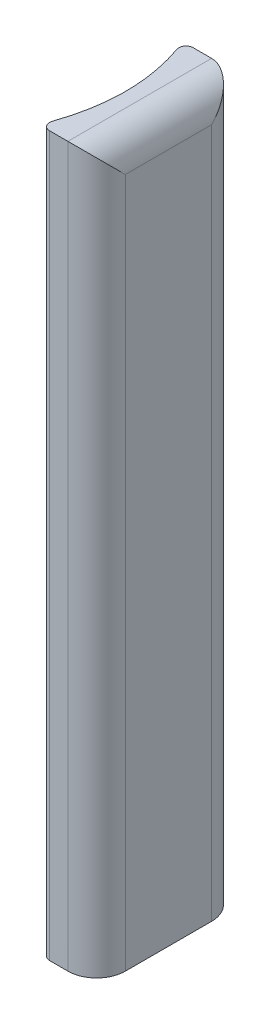
ISO-10303-21;
HEADER;
FILE_DESCRIPTION(('STEP AP214'),'2;1');
FILE_NAME('part.step','',(''),(''),'','','');
FILE_SCHEMA(('AUTOMOTIVE_DESIGN { 1 0 10303 214 1 1 1 1 }'));
ENDSEC;
DATA;
#1=APPLICATION_CONTEXT('core data for automotive mechanical design processes');
#2=APPLICATION_PROTOCOL_DEFINITION('international standard','automotive_design',2000,#1);
#3=PRODUCT_CONTEXT('',#1,'mechanical');
#4=PRODUCT('Part','Part','',(#3));
#5=PRODUCT_RELATED_PRODUCT_CATEGORY('part','',(#4));
#6=PRODUCT_DEFINITION_FORMATION('','',#4);
#7=PRODUCT_DEFINITION_CONTEXT('part definition',#1,'design');
#8=PRODUCT_DEFINITION('design','',#6,#7);
#9=PRODUCT_DEFINITION_SHAPE('','',#8);
#10=(LENGTH_UNIT() NAMED_UNIT(*) SI_UNIT(.MILLI.,.METRE.));
#11=(NAMED_UNIT(*) PLANE_ANGLE_UNIT() SI_UNIT($,.RADIAN.));
#12=(NAMED_UNIT(*) SI_UNIT($,.STERADIAN.) SOLID_ANGLE_UNIT());
#13=UNCERTAINTY_MEASURE_WITH_UNIT(LENGTH_MEASURE(1.E-05),#10,'distance_accuracy_value','');
#14=(GEOMETRIC_REPRESENTATION_CONTEXT(3) GLOBAL_UNCERTAINTY_ASSIGNED_CONTEXT((#13)) GLOBAL_UNIT_ASSIGNED_CONTEXT((#10,
#11,#12)) REPRESENTATION_CONTEXT('',''));
#15=CARTESIAN_POINT('',(0.,0.,0.));
#16=DIRECTION('',(0.,0.,1.));
#17=DIRECTION('',(1.,0.,0.));
#18=AXIS2_PLACEMENT_3D('',#15,#16,#17);
#19=CARTESIAN_POINT('',(-2.,-25.,-5.));
#20=DIRECTION('',(0.,-1.,0.));
#21=DIRECTION('',(0.,0.,-1.));
#22=AXIS2_PLACEMENT_3D('',#19,#20,#21);
#23=PLANE('',#22);
#24=CARTESIAN_POINT('',(-2.,-25.,-5.));
#25=CARTESIAN_POINT('',(0.,-25.,0.));
#26=CARTESIAN_POINT('',(-2.,-25.,5.));
#27=B_SPLINE_CURVE_WITH_KNOTS('',2,(#24,#25,#26),.UNSPECIFIED.,.F.,.F.,(3,3),(0.,1.),.UNSPECIFIED.);
#28=CARTESIAN_POINT('',(-1.75208229276444,-25.,4.33613391388124));
#29=VERTEX_POINT('',#28);
#30=CARTESIAN_POINT('',(-1.75208229276444,-25.,-4.33613391388124));
#31=VERTEX_POINT('',#30);
#32=EDGE_CURVE('E149',#29,#31,#27,.F.);
#33=ORIENTED_EDGE('',*,*,#32,.T.);
#34=CARTESIAN_POINT('',(-1.27969695660325,-25.,-4.5));
#35=DIRECTION('',(0.,-1.,0.));
#36=DIRECTION('',(0.,0.,-1.));
#37=AXIS2_PLACEMENT_3D('',#34,#35,#36);
#38=CIRCLE('',#37,0.5);
#39=CARTESIAN_POINT('',(-1.27969695660325,-25.,-5.));
#40=VERTEX_POINT('',#39);
#41=EDGE_CURVE('E177',#31,#40,#38,.T.);
#42=ORIENTED_EDGE('',*,*,#41,.T.);
#43=DIRECTION('',(1.,0.,0.));
#44=VECTOR('',#43,1.);
#45=CARTESIAN_POINT('',(-2.,-25.,-5.));
#46=LINE('',#45,#44);
#47=CARTESIAN_POINT('',(0.,-25.,-5.));
#48=VERTEX_POINT('',#47);
#49=EDGE_CURVE('E113',#40,#48,#46,.T.);
#50=ORIENTED_EDGE('',*,*,#49,.T.);
#51=CARTESIAN_POINT('',(0.,-25.,-3.));
#52=DIRECTION('',(0.,-1.,0.));
#53=DIRECTION('',(0.,0.,-1.));
#54=AXIS2_PLACEMENT_3D('',#51,#52,#53);
#55=CIRCLE('',#54,2.);
#56=CARTESIAN_POINT('',(2.,-25.,-3.));
#57=VERTEX_POINT('',#56);
#58=EDGE_CURVE('E107',#48,#57,#55,.T.);
#59=ORIENTED_EDGE('',*,*,#58,.T.);
#60=DIRECTION('',(0.,0.,1.));
#61=VECTOR('',#60,1.);
#62=CARTESIAN_POINT('',(2.,-25.,-5.));
#63=LINE('',#62,#61);
#64=CARTESIAN_POINT('',(2.,-25.,3.));
#65=VERTEX_POINT('',#64);
#66=EDGE_CURVE('E111',#57,#65,#63,.T.);
#67=ORIENTED_EDGE('',*,*,#66,.T.);
#68=CARTESIAN_POINT('',(0.,-25.,3.));
#69=DIRECTION('',(0.,-1.,0.));
#70=DIRECTION('',(0.,0.,-1.));
#71=AXIS2_PLACEMENT_3D('',#68,#69,#70);
#72=CIRCLE('',#71,2.);
#73=CARTESIAN_POINT('',(0.,-25.,5.));
#74=VERTEX_POINT('',#73);
#75=EDGE_CURVE('E119',#65,#74,#72,.T.);
#76=ORIENTED_EDGE('',*,*,#75,.T.);
#77=DIRECTION('',(1.,0.,0.));
#78=VECTOR('',#77,1.);
#79=CARTESIAN_POINT('',(-2.,-25.,5.));
#80=LINE('',#79,#78);
#81=CARTESIAN_POINT('',(-1.27969695660325,-25.,5.));
#82=VERTEX_POINT('',#81);
#83=EDGE_CURVE('E166',#82,#74,#80,.T.);
#84=ORIENTED_EDGE('',*,*,#83,.F.);
#85=CARTESIAN_POINT('',(-1.27969695660325,-25.,4.5));
#86=DIRECTION('',(0.,-1.,0.));
#87=DIRECTION('',(0.,0.,-1.));
#88=AXIS2_PLACEMENT_3D('',#85,#86,#87);
#89=CIRCLE('',#88,0.5);
#90=EDGE_CURVE('E175',#82,#29,#89,.T.);
#91=ORIENTED_EDGE('',*,*,#90,.T.);
#92=EDGE_LOOP('',(#33,#42,#50,#59,#67,#76,#84,#91));
#93=FACE_BOUND('',#92,.T.);
#94=ADVANCED_FACE('F38',(#93),#23,.T.);
#95=CARTESIAN_POINT('',(-2.,25.,-5.));
#96=DIRECTION('',(0.,1.,0.));
#97=DIRECTION('',(0.,0.,1.));
#98=AXIS2_PLACEMENT_3D('',#95,#96,#97);
#99=PLANE('',#98);
#100=DIRECTION('',(-1.,0.,0.));
#101=VECTOR('',#100,1.);
#102=CARTESIAN_POINT('',(-2.,25.,-5.));
#103=LINE('',#102,#101);
#104=CARTESIAN_POINT('',(0.,25.,-5.));
#105=VERTEX_POINT('',#104);
#106=CARTESIAN_POINT('',(-1.27969695660325,25.,-5.));
#107=VERTEX_POINT('',#106);
#108=EDGE_CURVE('E167',#105,#107,#103,.T.);
#109=ORIENTED_EDGE('',*,*,#108,.T.);
#110=CARTESIAN_POINT('',(-1.27969695660325,25.,-4.5));
#111=DIRECTION('',(0.,1.,0.));
#112=DIRECTION('',(0.,0.,1.));
#113=AXIS2_PLACEMENT_3D('',#110,#111,#112);
#114=CIRCLE('',#113,0.5);
#115=CARTESIAN_POINT('',(-1.75208229276294,25.,-4.33613391387692));
#116=VERTEX_POINT('',#115);
#117=EDGE_CURVE('E46',#107,#116,#114,.T.);
#118=ORIENTED_EDGE('',*,*,#117,.T.);
#119=CARTESIAN_POINT('',(-2.,25.,-5.));
#120=CARTESIAN_POINT('',(0.,25.,0.));
#121=CARTESIAN_POINT('',(-2.,25.,5.));
#122=B_SPLINE_CURVE_WITH_KNOTS('',2,(#119,#120,#121),.UNSPECIFIED.,.F.,.F.,(3,3),(0.,1.),.UNSPECIFIED.);
#123=CARTESIAN_POINT('',(-1.75208229276444,25.,4.33613391388124));
#124=VERTEX_POINT('',#123);
#125=EDGE_CURVE('E148',#116,#124,#122,.T.);
#126=ORIENTED_EDGE('',*,*,#125,.T.);
#127=CARTESIAN_POINT('',(-1.27969695660325,25.,4.5));
#128=DIRECTION('',(0.,1.,0.));
#129=DIRECTION('',(0.,0.,1.));
#130=AXIS2_PLACEMENT_3D('',#127,#128,#129);
#131=CIRCLE('',#130,0.5);
#132=CARTESIAN_POINT('',(-1.27969695660325,25.,5.));
#133=VERTEX_POINT('',#132);
#134=EDGE_CURVE('E53',#124,#133,#131,.T.);
#135=ORIENTED_EDGE('',*,*,#134,.T.);
#136=DIRECTION('',(-1.,0.,0.));
#137=VECTOR('',#136,1.);
#138=CARTESIAN_POINT('',(-2.,25.,5.));
#139=LINE('',#138,#137);
#140=CARTESIAN_POINT('',(0.,25.,5.));
#141=VERTEX_POINT('',#140);
#142=EDGE_CURVE('E152',#141,#133,#139,.T.);
#143=ORIENTED_EDGE('',*,*,#142,.F.);
#144=DIRECTION('',(0.,0.,1.));
#145=VECTOR('',#144,1.);
#146=CARTESIAN_POINT('',(0.,25.,-5.));
#147=LINE('',#146,#145);
#148=EDGE_CURVE('E118',#141,#105,#147,.F.);
#149=ORIENTED_EDGE('',*,*,#148,.T.);
#150=EDGE_LOOP('',(#109,#118,#126,#135,#143,#149));
#151=FACE_BOUND('',#150,.T.);
#152=ADVANCED_FACE('F183',(#151),#99,.T.);
#153=CARTESIAN_POINT('',(2.,-25.,-5.));
#154=DIRECTION('',(1.,0.,0.));
#155=DIRECTION('',(0.,0.,-1.));
#156=AXIS2_PLACEMENT_3D('',#153,#154,#155);
#157=PLANE('',#156);
#158=ORIENTED_EDGE('',*,*,#66,.F.);
#159=DIRECTION('',(0.,1.,0.));
#160=VECTOR('',#159,1.);
#161=CARTESIAN_POINT('',(2.,-25.,-3.));
#162=LINE('',#161,#160);
#163=CARTESIAN_POINT('',(2.,23.,-3.));
#164=VERTEX_POINT('',#163);
#165=EDGE_CURVE('E124',#57,#164,#162,.T.);
#166=ORIENTED_EDGE('',*,*,#165,.T.);
#167=DIRECTION('',(0.,0.,1.));
#168=VECTOR('',#167,1.);
#169=CARTESIAN_POINT('',(2.,23.,-5.));
#170=LINE('',#169,#168);
#171=CARTESIAN_POINT('',(2.,23.,3.));
#172=VERTEX_POINT('',#171);
#173=EDGE_CURVE('E133',#164,#172,#170,.T.);
#174=ORIENTED_EDGE('',*,*,#173,.T.);
#175=DIRECTION('',(0.,1.,0.));
#176=VECTOR('',#175,1.);
#177=CARTESIAN_POINT('',(2.,-25.,3.));
#178=LINE('',#177,#176);
#179=EDGE_CURVE('E126',#172,#65,#178,.F.);
#180=ORIENTED_EDGE('',*,*,#179,.T.);
#181=EDGE_LOOP('',(#158,#166,#174,#180));
#182=FACE_BOUND('',#181,.T.);
#183=ADVANCED_FACE('F123',(#182),#157,.T.);
#184=CARTESIAN_POINT('',(0.,0.,-5.));
#185=DIRECTION('',(0.,0.,-1.));
#186=DIRECTION('',(-1.,0.,0.));
#187=AXIS2_PLACEMENT_3D('',#184,#185,#186);
#188=PLANE('',#187);
#189=ORIENTED_EDGE('',*,*,#49,.F.);
#190=DIRECTION('',(0.,1.,0.));
#191=VECTOR('',#190,1.);
#192=CARTESIAN_POINT('',(-1.27969695660325,0.,-5.));
#193=LINE('',#192,#191);
#194=EDGE_CURVE('E61',#40,#107,#193,.T.);
#195=ORIENTED_EDGE('',*,*,#194,.T.);
#196=ORIENTED_EDGE('',*,*,#108,.F.);
#197=DIRECTION('',(0.,1.,0.));
#198=VECTOR('',#197,1.);
#199=CARTESIAN_POINT('',(0.,0.,-5.));
#200=LINE('',#199,#198);
#201=EDGE_CURVE('E132',#105,#48,#200,.F.);
#202=ORIENTED_EDGE('',*,*,#201,.T.);
#203=EDGE_LOOP('',(#189,#195,#196,#202));
#204=FACE_BOUND('',#203,.T.);
#205=ADVANCED_FACE('F192',(#204),#188,.T.);
#206=CARTESIAN_POINT('',(0.,0.,5.));
#207=DIRECTION('',(0.,0.,-1.));
#208=DIRECTION('',(-1.,0.,0.));
#209=AXIS2_PLACEMENT_3D('',#206,#207,#208);
#210=PLANE('',#209);
#211=ORIENTED_EDGE('',*,*,#142,.T.);
#212=DIRECTION('',(0.,-1.,0.));
#213=VECTOR('',#212,1.);
#214=CARTESIAN_POINT('',(-1.27969695660325,-25.,5.));
#215=LINE('',#214,#213);
#216=EDGE_CURVE('E11',#133,#82,#215,.T.);
#217=ORIENTED_EDGE('',*,*,#216,.T.);
#218=ORIENTED_EDGE('',*,*,#83,.T.);
#219=DIRECTION('',(0.,1.,0.));
#220=VECTOR('',#219,1.);
#221=CARTESIAN_POINT('',(0.,25.,5.));
#222=LINE('',#221,#220);
#223=EDGE_CURVE('E141',#74,#141,#222,.T.);
#224=ORIENTED_EDGE('',*,*,#223,.T.);
#225=EDGE_LOOP('',(#211,#217,#218,#224));
#226=FACE_BOUND('',#225,.T.);
#227=ADVANCED_FACE('F202',(#226),#210,.F.);
#228=CARTESIAN_POINT('',(-2.,-35.,-5.));
#229=CARTESIAN_POINT('',(0.,-35.,0.));
#230=CARTESIAN_POINT('',(-2.,-35.,5.));
#231=B_SPLINE_CURVE_WITH_KNOTS('',2,(#228,#229,#230),.UNSPECIFIED.,.F.,.F.,(3,3),(0.,1.),.UNSPECIFIED.);
#232=DIRECTION('',(0.,1.,0.));
#233=VECTOR('',#232,1.);
#234=SURFACE_OF_LINEAR_EXTRUSION('',#231,#233);
#235=ORIENTED_EDGE('',*,*,#125,.F.);
#236=DIRECTION('',(0.,1.,0.));
#237=VECTOR('',#236,1.);
#238=CARTESIAN_POINT('',(-1.7520822927629,25.,-4.3361339138768));
#239=LINE('',#238,#237);
#240=EDGE_CURVE('E178',#116,#31,#239,.F.);
#241=ORIENTED_EDGE('',*,*,#240,.T.);
#242=ORIENTED_EDGE('',*,*,#32,.F.);
#243=DIRECTION('',(0.,1.,0.));
#244=VECTOR('',#243,1.);
#245=CARTESIAN_POINT('',(-1.7520822927629,-25.,4.3361339138768));
#246=LINE('',#245,#244);
#247=EDGE_CURVE('E143',#29,#124,#246,.T.);
#248=ORIENTED_EDGE('',*,*,#247,.T.);
#249=EDGE_LOOP('',(#235,#241,#242,#248));
#250=FACE_BOUND('',#249,.T.);
#251=ADVANCED_FACE('F188',(#250),#234,.T.);
#252=CARTESIAN_POINT('',(0.,0.,3.));
#253=DIRECTION('',(0.,-1.,0.));
#254=DIRECTION('',(0.,0.,-1.));
#255=AXIS2_PLACEMENT_3D('',#252,#253,#254);
#256=CYLINDRICAL_SURFACE('',#255,2.);
#257=ORIENTED_EDGE('',*,*,#75,.F.);
#258=ORIENTED_EDGE('',*,*,#179,.F.);
#259=CARTESIAN_POINT('',(0.,23.,3.));
#260=DIRECTION('',(0.,-0.707106781186547,0.707106781186547));
#261=DIRECTION('',(0.,-0.707106781186547,-0.707106781186547));
#262=AXIS2_PLACEMENT_3D('',#259,#260,#261);
#263=ELLIPSE('',#262,2.82842712474619,2.);
#264=EDGE_CURVE('E145',#141,#172,#263,.F.);
#265=ORIENTED_EDGE('',*,*,#264,.F.);
#266=ORIENTED_EDGE('',*,*,#223,.F.);
#267=EDGE_LOOP('',(#257,#258,#265,#266));
#268=FACE_BOUND('',#267,.T.);
#269=ADVANCED_FACE('F198',(#268),#256,.T.);
#270=CARTESIAN_POINT('',(0.,23.,-5.));
#271=DIRECTION('',(0.,0.,1.));
#272=DIRECTION('',(1.,0.,0.));
#273=AXIS2_PLACEMENT_3D('',#270,#271,#272);
#274=CYLINDRICAL_SURFACE('',#273,2.);
#275=ORIENTED_EDGE('',*,*,#264,.T.);
#276=ORIENTED_EDGE('',*,*,#173,.F.);
#277=CARTESIAN_POINT('',(0.,23.,-3.));
#278=DIRECTION('',(0.,0.707106781186547,0.707106781186547));
#279=DIRECTION('',(0.,-0.707106781186547,0.707106781186547));
#280=AXIS2_PLACEMENT_3D('',#277,#278,#279);
#281=ELLIPSE('',#280,2.82842712474619,2.);
#282=EDGE_CURVE('E130',#105,#164,#281,.F.);
#283=ORIENTED_EDGE('',*,*,#282,.F.);
#284=ORIENTED_EDGE('',*,*,#148,.F.);
#285=EDGE_LOOP('',(#275,#276,#283,#284));
#286=FACE_BOUND('',#285,.T.);
#287=ADVANCED_FACE('F195',(#286),#274,.T.);
#288=CARTESIAN_POINT('',(0.,-25.,-3.));
#289=DIRECTION('',(0.,1.,0.));
#290=DIRECTION('',(0.,0.,1.));
#291=AXIS2_PLACEMENT_3D('',#288,#289,#290);
#292=CYLINDRICAL_SURFACE('',#291,2.);
#293=ORIENTED_EDGE('',*,*,#58,.F.);
#294=ORIENTED_EDGE('',*,*,#201,.F.);
#295=ORIENTED_EDGE('',*,*,#282,.T.);
#296=ORIENTED_EDGE('',*,*,#165,.F.);
#297=EDGE_LOOP('',(#293,#294,#295,#296));
#298=FACE_BOUND('',#297,.T.);
#299=ADVANCED_FACE('F128',(#298),#292,.T.);
#300=CARTESIAN_POINT('',(-1.27969695660325,0.,-4.5));
#301=DIRECTION('',(0.,1.,0.));
#302=DIRECTION('',(0.,0.,1.));
#303=AXIS2_PLACEMENT_3D('',#300,#301,#302);
#304=CYLINDRICAL_SURFACE('',#303,0.5);
#305=ORIENTED_EDGE('',*,*,#117,.F.);
#306=ORIENTED_EDGE('',*,*,#194,.F.);
#307=ORIENTED_EDGE('',*,*,#41,.F.);
#308=ORIENTED_EDGE('',*,*,#240,.F.);
#309=EDGE_LOOP('',(#305,#306,#307,#308));
#310=FACE_BOUND('',#309,.T.);
#311=ADVANCED_FACE('F191',(#310),#304,.T.);
#312=CARTESIAN_POINT('',(-1.27969695660325,0.,4.5));
#313=DIRECTION('',(0.,1.,0.));
#314=DIRECTION('',(0.,0.,1.));
#315=AXIS2_PLACEMENT_3D('',#312,#313,#314);
#316=CYLINDRICAL_SURFACE('',#315,0.5);
#317=ORIENTED_EDGE('',*,*,#134,.F.);
#318=ORIENTED_EDGE('',*,*,#247,.F.);
#319=ORIENTED_EDGE('',*,*,#90,.F.);
#320=ORIENTED_EDGE('',*,*,#216,.F.);
#321=EDGE_LOOP('',(#317,#318,#319,#320));
#322=FACE_BOUND('',#321,.T.);
#323=ADVANCED_FACE('F40',(#322),#316,.T.);
#324=CLOSED_SHELL('',(#94,#152,#183,#205,#227,#251,#269,#287,#299,#311,#323));
#325=MANIFOLD_SOLID_BREP('B2',#324);
#326=ADVANCED_BREP_SHAPE_REPRESENTATION('',(#18,#325),#14);
#327=SHAPE_DEFINITION_REPRESENTATION(#9,#326);
ENDSEC;
END-ISO-10303-21;
